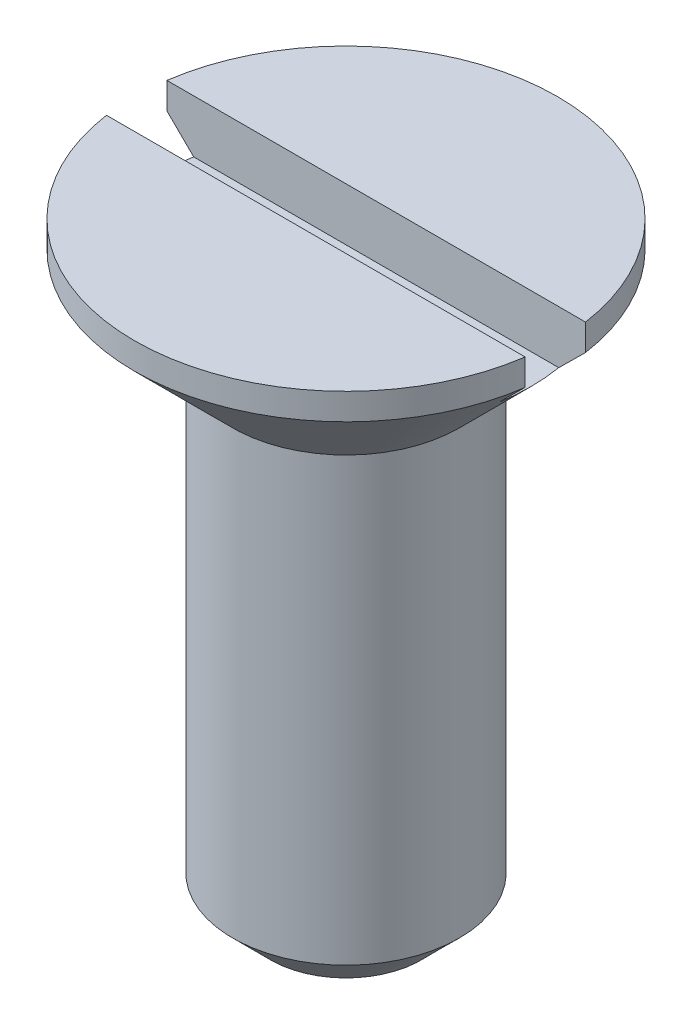
ISO-10303-21;
HEADER;
FILE_DESCRIPTION(('STEP AP214'),'2;1');
FILE_NAME('part.step','',(''),(''),'','','');
FILE_SCHEMA(('AUTOMOTIVE_DESIGN { 1 0 10303 214 1 1 1 1 }'));
ENDSEC;
DATA;
#1=APPLICATION_CONTEXT('core data for automotive mechanical design processes');
#2=APPLICATION_PROTOCOL_DEFINITION('international standard','automotive_design',2000,#1);
#3=PRODUCT_CONTEXT('',#1,'mechanical');
#4=PRODUCT('Part','Part','',(#3));
#5=PRODUCT_RELATED_PRODUCT_CATEGORY('part','',(#4));
#6=PRODUCT_DEFINITION_FORMATION('','',#4);
#7=PRODUCT_DEFINITION_CONTEXT('part definition',#1,'design');
#8=PRODUCT_DEFINITION('design','',#6,#7);
#9=PRODUCT_DEFINITION_SHAPE('','',#8);
#10=(LENGTH_UNIT() NAMED_UNIT(*) SI_UNIT(.MILLI.,.METRE.));
#11=(NAMED_UNIT(*) PLANE_ANGLE_UNIT() SI_UNIT($,.RADIAN.));
#12=(NAMED_UNIT(*) SI_UNIT($,.STERADIAN.) SOLID_ANGLE_UNIT());
#13=UNCERTAINTY_MEASURE_WITH_UNIT(LENGTH_MEASURE(1.E-05),#10,'distance_accuracy_value','');
#14=(GEOMETRIC_REPRESENTATION_CONTEXT(3) GLOBAL_UNCERTAINTY_ASSIGNED_CONTEXT((#13)) GLOBAL_UNIT_ASSIGNED_CONTEXT((#10,
#11,#12)) REPRESENTATION_CONTEXT('',''));
#15=CARTESIAN_POINT('',(0.,0.,0.));
#16=DIRECTION('',(0.,0.,1.));
#17=DIRECTION('',(1.,0.,0.));
#18=AXIS2_PLACEMENT_3D('',#15,#16,#17);
#19=CARTESIAN_POINT('',(0.,125.763182897862,0.));
#20=DIRECTION('',(0.,1.,0.));
#21=DIRECTION('',(-1.,0.,0.));
#22=AXIS2_PLACEMENT_3D('',#19,#20,#21);
#23=CYLINDRICAL_SURFACE('',#22,2.80000000000001);
#24=CARTESIAN_POINT('',(0.,91.6850422227854,0.));
#25=DIRECTION('',(0.,1.,0.));
#26=DIRECTION('',(-1.,0.,0.));
#27=AXIS2_PLACEMENT_3D('',#24,#25,#26);
#28=CIRCLE('',#27,2.80000000000001);
#29=CARTESIAN_POINT('',(2.77128129211021,91.6850422227854,-0.4));
#30=VERTEX_POINT('',#29);
#31=CARTESIAN_POINT('',(-2.77128129211022,91.6850422227854,-0.4));
#32=VERTEX_POINT('',#31);
#33=EDGE_CURVE('E103',#30,#32,#28,.T.);
#34=ORIENTED_EDGE('',*,*,#33,.T.);
#35=DIRECTION('',(0.,1.,0.));
#36=VECTOR('',#35,1.);
#37=CARTESIAN_POINT('',(-2.77128129211022,125.763182897862,-0.4));
#38=LINE('',#37,#36);
#39=CARTESIAN_POINT('',(-2.77128129211022,92.0350422227854,-0.4));
#40=VERTEX_POINT('',#39);
#41=EDGE_CURVE('E136',#32,#40,#38,.T.);
#42=ORIENTED_EDGE('',*,*,#41,.T.);
#43=CARTESIAN_POINT('',(0.,92.0350422227854,0.));
#44=DIRECTION('',(0.,1.,0.));
#45=DIRECTION('',(-1.,0.,0.));
#46=AXIS2_PLACEMENT_3D('',#43,#44,#45);
#47=CIRCLE('',#46,2.80000000000001);
#48=CARTESIAN_POINT('',(2.77128129211021,92.0350422227854,-0.4));
#49=VERTEX_POINT('',#48);
#50=EDGE_CURVE('E100',#49,#40,#47,.T.);
#51=ORIENTED_EDGE('',*,*,#50,.F.);
#52=DIRECTION('',(0.,1.,0.));
#53=VECTOR('',#52,1.);
#54=CARTESIAN_POINT('',(2.77128129211021,125.763182897862,-0.4));
#55=LINE('',#54,#53);
#56=EDGE_CURVE('E106',#49,#30,#55,.F.);
#57=ORIENTED_EDGE('',*,*,#56,.T.);
#58=EDGE_LOOP('',(#34,#42,#51,#57));
#59=FACE_BOUND('',#58,.T.);
#60=ADVANCED_FACE('F29',(#59),#23,.T.);
#61=CARTESIAN_POINT('',(0.,92.0350422227854,0.));
#62=DIRECTION('',(0.,-1.,0.));
#63=DIRECTION('',(1.,0.,0.));
#64=AXIS2_PLACEMENT_3D('',#61,#62,#63);
#65=PLANE('',#64);
#66=ORIENTED_EDGE('',*,*,#50,.T.);
#67=DIRECTION('',(1.,0.,0.));
#68=VECTOR('',#67,1.);
#69=CARTESIAN_POINT('',(0.,92.0350422227854,-0.4));
#70=LINE('',#69,#68);
#71=EDGE_CURVE('E88',#40,#49,#70,.T.);
#72=ORIENTED_EDGE('',*,*,#71,.T.);
#73=EDGE_LOOP('',(#66,#72));
#74=FACE_BOUND('',#73,.T.);
#75=ADVANCED_FACE('F162',(#74),#65,.F.);
#76=CARTESIAN_POINT('',(-2.77128129211022,91.6850422227854,0.4));
#77=VERTEX_POINT('',#76);
#78=CARTESIAN_POINT('',(2.77128129211021,91.6850422227854,0.4));
#79=VERTEX_POINT('',#78);
#80=EDGE_CURVE('E89',#77,#79,#28,.T.);
#81=ORIENTED_EDGE('',*,*,#80,.T.);
#82=DIRECTION('',(0.,1.,0.));
#83=VECTOR('',#82,1.);
#84=CARTESIAN_POINT('',(2.77128129211021,125.763182897862,0.4));
#85=LINE('',#84,#83);
#86=CARTESIAN_POINT('',(2.77128129211021,92.0350422227854,0.4));
#87=VERTEX_POINT('',#86);
#88=EDGE_CURVE('E83',#79,#87,#85,.T.);
#89=ORIENTED_EDGE('',*,*,#88,.T.);
#90=CARTESIAN_POINT('',(-2.77128129211022,92.0350422227854,0.4));
#91=VERTEX_POINT('',#90);
#92=EDGE_CURVE('E93',#91,#87,#47,.T.);
#93=ORIENTED_EDGE('',*,*,#92,.F.);
#94=DIRECTION('',(0.,1.,0.));
#95=VECTOR('',#94,1.);
#96=CARTESIAN_POINT('',(-2.77128129211022,125.763182897862,0.4));
#97=LINE('',#96,#95);
#98=EDGE_CURVE('E44',#91,#77,#97,.F.);
#99=ORIENTED_EDGE('',*,*,#98,.T.);
#100=EDGE_LOOP('',(#81,#89,#93,#99));
#101=FACE_BOUND('',#100,.T.);
#102=ADVANCED_FACE('F31',(#101),#23,.T.);
#103=CARTESIAN_POINT('',(0.,90.3850422227854,0.));
#104=DIRECTION('',(0.,1.,0.));
#105=DIRECTION('',(-1.,0.,0.));
#106=AXIS2_PLACEMENT_3D('',#103,#104,#105);
#107=CONICAL_SURFACE('',#106,1.50000000000001,0.785398163397445);
#108=ORIENTED_EDGE('',*,*,#33,.F.);
#109=CARTESIAN_POINT('',(6.15376964499759,95.0517983265805,-0.400000000000001));
#110=CARTESIAN_POINT('',(5.94224348350112,94.840721242218,-0.400000000000001));
#111=CARTESIAN_POINT('',(5.73069782055002,94.6296636833897,-0.400000000000001));
#112=CARTESIAN_POINT('',(5.30753814852964,94.2076089013756,-0.400000000000001));
#113=CARTESIAN_POINT('',(5.09592413821653,93.9966116794368,-0.400000000000001));
#114=CARTESIAN_POINT('',(4.6725142237376,93.5746149461533,-0.400000000000001));
#115=CARTESIAN_POINT('',(4.46071828049446,93.363615474014,-0.400000000000001));
#116=CARTESIAN_POINT('',(4.03699504309279,92.9417564142658,-0.400000000000001));
#117=CARTESIAN_POINT('',(3.82506775148861,92.7308968240922,-0.400000000000001));
#118=CARTESIAN_POINT('',(3.39796110186069,92.3063841744852,-0.4));
#119=CARTESIAN_POINT('',(3.18277858312349,92.0927342949834,-0.4));
#120=CARTESIAN_POINT('',(2.7520109573441,91.6658163047777,-0.4));
#121=CARTESIAN_POINT('',(2.53642582862041,91.4525482159209,-0.4));
#122=CARTESIAN_POINT('',(2.21246212200739,91.1332998015317,-0.4));
#123=CARTESIAN_POINT('',(2.10439149332944,91.027007228392,-0.4));
#124=CARTESIAN_POINT('',(1.8879200375853,90.8147539430028,-0.4));
#125=CARTESIAN_POINT('',(1.77951920317701,90.7087932382402,-0.4));
#126=CARTESIAN_POINT('',(1.5621944761014,90.4974300750143,-0.4));
#127=CARTESIAN_POINT('',(1.45327063843828,90.3920275601964,-0.4));
#128=CARTESIAN_POINT('',(1.28912929352075,90.234715493658,-0.4));
#129=CARTESIAN_POINT('',(1.23429058280153,90.1824110313711,-0.4));
#130=CARTESIAN_POINT('',(1.12424387511607,90.0781923940908,-0.4));
#131=CARTESIAN_POINT('',(1.06903588304917,90.0262782139387,-0.4));
#132=CARTESIAN_POINT('',(0.983474783419313,89.9466930085838,-0.4));
#133=CARTESIAN_POINT('',(0.95331974597589,89.9188092128691,-0.4));
#134=CARTESIAN_POINT('',(0.8927950464271,89.8632741952398,-0.4));
#135=CARTESIAN_POINT('',(0.8624253802002,89.8356229778138,-0.4));
#136=CARTESIAN_POINT('',(0.801425593006168,89.7806467407496,-0.4));
#137=CARTESIAN_POINT('',(0.770795647331402,89.753321527409,-0.4));
#138=CARTESIAN_POINT('',(0.709159312988183,89.6991025639975,-0.4));
#139=CARTESIAN_POINT('',(0.678152938714246,89.6722087975189,-0.4));
#140=CARTESIAN_POINT('',(0.601711767853773,89.6071772924953,-0.4));
#141=CARTESIAN_POINT('',(0.555997028960764,89.569362268687,-0.4));
#142=CARTESIAN_POINT('',(0.486022479031603,89.5143388831423,-0.4));
#143=CARTESIAN_POINT('',(0.462444581720205,89.4962672545415,-0.4));
#144=CARTESIAN_POINT('',(0.414668181078615,89.4609678967871,-0.4));
#145=CARTESIAN_POINT('',(0.390469811382847,89.4437399882048,-0.4));
#146=CARTESIAN_POINT('',(0.332528644992307,89.4046213507061,-0.4));
#147=CARTESIAN_POINT('',(0.298438523796045,89.3832378829465,-0.4));
#148=CARTESIAN_POINT('',(0.227989995719911,89.3445140352947,-0.4));
#149=CARTESIAN_POINT('',(0.191637882588598,89.327163021777,-0.4));
#150=CARTESIAN_POINT('',(0.130420816044102,89.3052059074646,-0.4));
#151=CARTESIAN_POINT('',(0.10642880807801,89.2982619280238,-0.4));
#152=CARTESIAN_POINT('',(0.0576606648347406,89.2884774731962,-0.4));
#153=CARTESIAN_POINT('',(0.0328876933913012,89.2856221880439,-0.4));
#154=CARTESIAN_POINT('',(-0.0168874599605493,89.2846222445155,-0.4));
#155=CARTESIAN_POINT('',(-0.0418901654491117,89.28650188713,-0.4));
#156=CARTESIAN_POINT('',(-0.0912113554483213,89.2945794640738,-0.4));
#157=CARTESIAN_POINT('',(-0.11552773905749,89.3007894176915,-0.4));
#158=CARTESIAN_POINT('',(-0.16380547199542,89.3166593926004,-0.4));
#159=CARTESIAN_POINT('',(-0.18773151942435,89.3264219136148,-0.4));
#160=CARTESIAN_POINT('',(-0.234521299889117,89.3482604752016,-0.4));
#161=CARTESIAN_POINT('',(-0.257383020337466,89.360340693889,-0.4));
#162=CARTESIAN_POINT('',(-0.302392866406819,89.3861396867375,-0.4));
#163=CARTESIAN_POINT('',(-0.324533692268337,89.3998709668022,-0.4));
#164=CARTESIAN_POINT('',(-0.368091142585359,89.4283860332485,-0.4));
#165=CARTESIAN_POINT('',(-0.389508367534428,89.4431689136386,-0.4));
#166=CARTESIAN_POINT('',(-0.456611639791696,89.4912195580824,-0.4));
#167=CARTESIAN_POINT('',(-0.50131882876468,89.5258438581652,-0.4));
#168=CARTESIAN_POINT('',(-0.589333151358712,89.5968387408742,-0.4));
#169=CARTESIAN_POINT('',(-0.632639344400892,89.6332104575467,-0.4));
#170=CARTESIAN_POINT('',(-0.718448415425899,89.7070453584291,-0.4));
#171=CARTESIAN_POINT('',(-0.760949672140399,89.7445104243675,-0.4));
#172=CARTESIAN_POINT('',(-0.845359308704239,89.8200735443918,-0.4));
#173=CARTESIAN_POINT('',(-0.887267858807438,89.8581714095773,-0.4));
#174=CARTESIAN_POINT('',(-1.01216330814142,89.9728721148943,-0.4));
#175=CARTESIAN_POINT('',(-1.09457157164822,90.0501038770166,-0.4));
#176=CARTESIAN_POINT('',(-1.25849767626772,90.2053245759997,-0.4));
#177=CARTESIAN_POINT('',(-1.34001637946953,90.283312609494,-0.4));
#178=CARTESIAN_POINT('',(-1.50218627159786,90.4394174140191,-0.4));
#179=CARTESIAN_POINT('',(-1.58283974181426,90.5175318152214,-0.4));
#180=CARTESIAN_POINT('',(-1.7438418683818,90.6740742999587,-0.4));
#181=CARTESIAN_POINT('',(-1.82419052327697,90.7525023849883,-0.4));
#182=CARTESIAN_POINT('',(-2.06493581330267,90.9881001041679,-0.4));
#183=CARTESIAN_POINT('',(-2.22502858211589,91.1455801110599,-0.4));
#184=CARTESIAN_POINT('',(-2.54487140750702,91.4610264248858,-0.4));
#185=CARTESIAN_POINT('',(-2.70462128390291,91.6189929141463,-0.4));
#186=CARTESIAN_POINT('',(-3.02387107200538,91.935175267987,-0.4));
#187=CARTESIAN_POINT('',(-3.18337098605438,92.0933911302021,-0.4));
#188=CARTESIAN_POINT('',(-3.66161213354478,92.5682397576378,-0.4));
#189=CARTESIAN_POINT('',(-3.98012447834661,92.885102945423,-0.4));
#190=CARTESIAN_POINT('',(-4.61683093750955,93.5190791605516,-0.399999999999999));
#191=CARTESIAN_POINT('',(-4.93502508283666,93.8361921568168,-0.399999999999999));
#192=CARTESIAN_POINT('',(-5.40327653343319,94.3030925346914,-0.399999999999999));
#193=CARTESIAN_POINT('',(-5.55339720221333,94.4528163705911,-0.399999999999999));
#194=CARTESIAN_POINT('',(-5.85360544609959,94.7522892561713,-0.399999999999999));
#195=CARTESIAN_POINT('',(-6.00369302197777,94.9020383050777,-0.399999999999999));
#196=CARTESIAN_POINT('',(-6.15376964499761,95.0517983265805,-0.399999999999999));
#197=B_SPLINE_CURVE_WITH_KNOTS('',3,(#109,#110,#111,#112,#113,#114,#115,#116,#117,#118,#119,
#120,#121,#122,#123,#124,#125,#126,#127,#128,#129,#130,#131,#132,#133,#134,#135,#136,#137,#138,
#139,#140,#141,#142,#143,#144,#145,#146,#147,#148,#149,#150,#151,#152,#153,#154,#155,#156,#157,
#158,#159,#160,#161,#162,#163,#164,#165,#166,#167,#168,#169,#170,#171,#172,#173,#174,#175,#176,
#177,#178,#179,#180,#181,#182,#183,#184,#185,#186,#187,#188,#189,#190,#191,#192,#193,#194,#195,
#196),.UNSPECIFIED.,.F.,.F.,(4,2,2,2,2,2,2,2,2,2,2,2,2,2,2,2,2,2,2,2,2,2,2,2,2,2,2,2,2,2,2,2,2,
2,2,2,2,2,2,2,2,2,2,4),(0.,0.896477387067401,1.79297212919518,2.68985820595076,3.5867273563352,
4.49642391407687,5.40617096156973,5.86091909041101,6.31567740544315,6.77038889774219,
6.99773639013607,7.22508087221738,7.34829311300866,7.47150772631838,7.59464506423539,
7.71777770815696,7.89571062797183,7.98481890806048,8.07390815501086,8.19452277680273,
8.31481563318155,8.38948065025888,8.46387453115933,8.53865099959746,8.61363584938589,
8.69098233996737,8.76846959595682,8.84658590529905,8.9246357111978,9.09417060464475,
9.26381705040649,9.43377503776829,9.60368317069483,9.9424934975876,10.2809395472855,
10.6177784763891,10.9546190123933,11.6283134141745,12.302302002651,12.9762842368722,
14.3241233595907,15.6718152257355,16.3078820257655,16.9439319573642),.UNSPECIFIED.);
#198=CARTESIAN_POINT('',(2.41712639305435,91.3350422227853,-0.4));
#199=VERTEX_POINT('',#198);
#200=EDGE_CURVE('E52',#30,#199,#197,.T.);
#201=ORIENTED_EDGE('',*,*,#200,.T.);
#202=CARTESIAN_POINT('',(0.,91.3350422227853,0.));
#203=DIRECTION('',(0.,1.,0.));
#204=DIRECTION('',(0.,0.,1.));
#205=AXIS2_PLACEMENT_3D('',#202,#203,#204);
#206=CIRCLE('',#205,2.45);
#207=CARTESIAN_POINT('',(2.41712639305435,91.3350422227853,0.4));
#208=VERTEX_POINT('',#207);
#209=EDGE_CURVE('E115',#208,#199,#206,.T.);
#210=ORIENTED_EDGE('',*,*,#209,.F.);
#211=CARTESIAN_POINT('',(-6.15376964499761,95.0517983265805,0.400000000000001));
#212=CARTESIAN_POINT('',(-5.94224348350114,94.840721242218,0.400000000000001));
#213=CARTESIAN_POINT('',(-5.73069782055004,94.6296636833898,0.400000000000001));
#214=CARTESIAN_POINT('',(-5.30753814852967,94.2076089013756,0.400000000000001));
#215=CARTESIAN_POINT('',(-5.09592413821655,93.9966116794369,0.400000000000001));
#216=CARTESIAN_POINT('',(-4.67251422373763,93.5746149461533,0.400000000000001));
#217=CARTESIAN_POINT('',(-4.46071828049449,93.363615474014,0.400000000000001));
#218=CARTESIAN_POINT('',(-4.03699504309284,92.9417564142658,0.400000000000001));
#219=CARTESIAN_POINT('',(-3.82506775148865,92.7308968240922,0.4));
#220=CARTESIAN_POINT('',(-3.39796110186072,92.3063841744852,0.4));
#221=CARTESIAN_POINT('',(-3.18277858312352,92.0927342949834,0.4));
#222=CARTESIAN_POINT('',(-2.75201095734414,91.6658163047777,0.4));
#223=CARTESIAN_POINT('',(-2.53642582862045,91.4525482159209,0.4));
#224=CARTESIAN_POINT('',(-2.21246212200743,91.1332998015317,0.4));
#225=CARTESIAN_POINT('',(-2.10439149332948,91.027007228392,0.4));
#226=CARTESIAN_POINT('',(-1.88792003758533,90.8147539430028,0.4));
#227=CARTESIAN_POINT('',(-1.77951920317704,90.7087932382402,0.4));
#228=CARTESIAN_POINT('',(-1.56219447610142,90.4974300750143,0.4));
#229=CARTESIAN_POINT('',(-1.45327063843829,90.3920275601964,0.4));
#230=CARTESIAN_POINT('',(-1.28912929352077,90.234715493658,0.4));
#231=CARTESIAN_POINT('',(-1.23429058280155,90.1824110313711,0.4));
#232=CARTESIAN_POINT('',(-1.12424387511609,90.0781923940908,0.4));
#233=CARTESIAN_POINT('',(-1.06903588304919,90.0262782139387,0.4));
#234=CARTESIAN_POINT('',(-0.983474783419322,89.9466930085838,0.4));
#235=CARTESIAN_POINT('',(-0.953319745975897,89.9188092128691,0.4));
#236=CARTESIAN_POINT('',(-0.89279504642711,89.8632741952398,0.4));
#237=CARTESIAN_POINT('',(-0.862425380200216,89.8356229778138,0.4));
#238=CARTESIAN_POINT('',(-0.801425593006187,89.7806467407496,0.4));
#239=CARTESIAN_POINT('',(-0.770795647331419,89.753321527409,0.4));
#240=CARTESIAN_POINT('',(-0.709159312988199,89.6991025639975,0.4));
#241=CARTESIAN_POINT('',(-0.678152938714263,89.6722087975189,0.4));
#242=CARTESIAN_POINT('',(-0.601711767853792,89.6071772924953,0.4));
#243=CARTESIAN_POINT('',(-0.555997028960782,89.569362268687,0.4));
#244=CARTESIAN_POINT('',(-0.486022479031623,89.5143388831424,0.4));
#245=CARTESIAN_POINT('',(-0.462444581720224,89.4962672545415,0.4));
#246=CARTESIAN_POINT('',(-0.414668181078632,89.4609678967871,0.4));
#247=CARTESIAN_POINT('',(-0.390469811382861,89.4437399882048,0.4));
#248=CARTESIAN_POINT('',(-0.332528644992319,89.4046213507061,0.4));
#249=CARTESIAN_POINT('',(-0.298438523796057,89.3832378829465,0.4));
#250=CARTESIAN_POINT('',(-0.227989995719923,89.3445140352947,0.4));
#251=CARTESIAN_POINT('',(-0.191637882588611,89.327163021777,0.4));
#252=CARTESIAN_POINT('',(-0.130420816044115,89.3052059074646,0.4));
#253=CARTESIAN_POINT('',(-0.106428808078023,89.2982619280238,0.4));
#254=CARTESIAN_POINT('',(-0.0576606648347534,89.2884774731962,0.4));
#255=CARTESIAN_POINT('',(-0.0328876933913141,89.2856221880439,0.4));
#256=CARTESIAN_POINT('',(0.0168874599605377,89.2846222445155,0.4));
#257=CARTESIAN_POINT('',(0.0418901654491015,89.28650188713,0.4));
#258=CARTESIAN_POINT('',(0.0912113554483107,89.2945794640738,0.4));
#259=CARTESIAN_POINT('',(0.115527739057478,89.3007894176915,0.4));
#260=CARTESIAN_POINT('',(0.163805471995408,89.3166593926004,0.4));
#261=CARTESIAN_POINT('',(0.187731519424341,89.3264219136148,0.4));
#262=CARTESIAN_POINT('',(0.234521299889108,89.3482604752016,0.4));
#263=CARTESIAN_POINT('',(0.257383020337454,89.360340693889,0.4));
#264=CARTESIAN_POINT('',(0.302392866406805,89.3861396867375,0.4));
#265=CARTESIAN_POINT('',(0.324533692268323,89.3998709668022,0.4));
#266=CARTESIAN_POINT('',(0.368091142585346,89.4283860332485,0.4));
#267=CARTESIAN_POINT('',(0.389508367534415,89.4431689136386,0.4));
#268=CARTESIAN_POINT('',(0.456611639791688,89.4912195580824,0.4));
#269=CARTESIAN_POINT('',(0.501318828764677,89.5258438581653,0.4));
#270=CARTESIAN_POINT('',(0.589333151358709,89.5968387408742,0.4));
#271=CARTESIAN_POINT('',(0.632639344400882,89.6332104575467,0.4));
#272=CARTESIAN_POINT('',(0.718448415425888,89.7070453584291,0.4));
#273=CARTESIAN_POINT('',(0.760949672140392,89.7445104243675,0.4));
#274=CARTESIAN_POINT('',(0.845359308704232,89.8200735443918,0.4));
#275=CARTESIAN_POINT('',(0.887267858807427,89.8581714095773,0.4));
#276=CARTESIAN_POINT('',(1.01216330814141,89.9728721148944,0.4));
#277=CARTESIAN_POINT('',(1.09457157164821,90.0501038770166,0.4));
#278=CARTESIAN_POINT('',(1.25849767626771,90.2053245759997,0.4));
#279=CARTESIAN_POINT('',(1.34001637946952,90.283312609494,0.4));
#280=CARTESIAN_POINT('',(1.50218627159784,90.4394174140191,0.4));
#281=CARTESIAN_POINT('',(1.58283974181425,90.5175318152214,0.4));
#282=CARTESIAN_POINT('',(1.74384186838178,90.6740742999587,0.4));
#283=CARTESIAN_POINT('',(1.82419052327695,90.7525023849883,0.4));
#284=CARTESIAN_POINT('',(2.06493581330266,90.9881001041679,0.4));
#285=CARTESIAN_POINT('',(2.22502858211588,91.1455801110599,0.4));
#286=CARTESIAN_POINT('',(2.544871407507,91.4610264248858,0.4));
#287=CARTESIAN_POINT('',(2.7046212839029,91.6189929141463,0.4));
#288=CARTESIAN_POINT('',(3.02387107200537,91.935175267987,0.4));
#289=CARTESIAN_POINT('',(3.18337098605437,92.0933911302021,0.4));
#290=CARTESIAN_POINT('',(3.66161213354476,92.5682397576378,0.4));
#291=CARTESIAN_POINT('',(3.9801244783466,92.885102945423,0.4));
#292=CARTESIAN_POINT('',(4.61683093750954,93.5190791605516,0.399999999999999));
#293=CARTESIAN_POINT('',(4.93502508283664,93.8361921568168,0.399999999999999));
#294=CARTESIAN_POINT('',(5.40327653343317,94.3030925346914,0.399999999999999));
#295=CARTESIAN_POINT('',(5.55339720221331,94.4528163705911,0.399999999999999));
#296=CARTESIAN_POINT('',(5.85360544609957,94.7522892561713,0.399999999999999));
#297=CARTESIAN_POINT('',(6.00369302197775,94.9020383050777,0.399999999999999));
#298=CARTESIAN_POINT('',(6.15376964499759,95.0517983265805,0.399999999999999));
#299=B_SPLINE_CURVE_WITH_KNOTS('',3,(#211,#212,#213,#214,#215,#216,#217,#218,#219,#220,#221,
#222,#223,#224,#225,#226,#227,#228,#229,#230,#231,#232,#233,#234,#235,#236,#237,#238,#239,#240,
#241,#242,#243,#244,#245,#246,#247,#248,#249,#250,#251,#252,#253,#254,#255,#256,#257,#258,#259,
#260,#261,#262,#263,#264,#265,#266,#267,#268,#269,#270,#271,#272,#273,#274,#275,#276,#277,#278,
#279,#280,#281,#282,#283,#284,#285,#286,#287,#288,#289,#290,#291,#292,#293,#294,#295,#296,#297,
#298),.UNSPECIFIED.,.F.,.F.,(4,2,2,2,2,2,2,2,2,2,2,2,2,2,2,2,2,2,2,2,2,2,2,2,2,2,2,2,2,2,2,2,2,
2,2,2,2,2,2,2,2,2,2,4),(0.,0.896477387067386,1.79297212919516,2.68985820595074,3.58672735633516,
4.49642391407684,5.40617096156971,5.86091909041097,6.31567740544313,6.77038889774218,
6.99773639013607,7.22508087221738,7.34829311300866,7.47150772631838,7.59464506423538,
7.71777770815696,7.89571062797182,7.98481890806047,8.07390815501086,8.19452277680273,
8.31481563318155,8.38948065025888,8.46387453115933,8.53865099959746,8.6136358493859,
8.69098233996738,8.76846959595683,8.84658590529906,8.9246357111978,9.09417060464477,
9.26381705040649,9.4337750377683,9.60368317069483,9.9424934975876,10.2809395472855,
10.6177784763891,10.9546190123933,11.6283134141745,12.302302002651,12.9762842368722,
14.3241233595907,15.6718152257355,16.3078820257655,16.9439319573642),.UNSPECIFIED.);
#300=EDGE_CURVE('E96',#208,#79,#299,.T.);
#301=ORIENTED_EDGE('',*,*,#300,.T.);
#302=ORIENTED_EDGE('',*,*,#80,.F.);
#303=CARTESIAN_POINT('',(-2.41712639305437,91.3350422227853,0.4));
#304=VERTEX_POINT('',#303);
#305=EDGE_CURVE('E95',#77,#304,#299,.T.);
#306=ORIENTED_EDGE('',*,*,#305,.T.);
#307=CARTESIAN_POINT('',(-2.41712639305437,91.3350422227853,-0.4));
#308=VERTEX_POINT('',#307);
#309=EDGE_CURVE('E114',#308,#304,#206,.T.);
#310=ORIENTED_EDGE('',*,*,#309,.F.);
#311=EDGE_CURVE('E131',#308,#32,#197,.T.);
#312=ORIENTED_EDGE('',*,*,#311,.T.);
#313=EDGE_LOOP('',(#108,#201,#210,#301,#302,#306,#310,#312));
#314=FACE_BOUND('',#313,.T.);
#315=CARTESIAN_POINT('',(0.,90.3850422227854,0.));
#316=DIRECTION('',(0.,1.,0.));
#317=DIRECTION('',(-1.,0.,0.));
#318=AXIS2_PLACEMENT_3D('',#315,#316,#317);
#319=CIRCLE('',#318,1.50000000000001);
#320=CARTESIAN_POINT('',(-1.50000000000002,90.3850422227854,0.));
#321=VERTEX_POINT('',#320);
#322=EDGE_CURVE('E99',#321,#321,#319,.T.);
#323=ORIENTED_EDGE('',*,*,#322,.T.);
#324=EDGE_LOOP('',(#323));
#325=FACE_BOUND('',#324,.T.);
#326=ADVANCED_FACE('F134',(#314,#325),#107,.T.);
#327=CARTESIAN_POINT('',(0.,125.763182897862,0.));
#328=DIRECTION('',(0.,1.,0.));
#329=DIRECTION('',(-1.,0.,0.));
#330=AXIS2_PLACEMENT_3D('',#327,#328,#329);
#331=CYLINDRICAL_SURFACE('',#330,1.50000000000001);
#332=CARTESIAN_POINT('',(0.,84.5350422227853,0.));
#333=DIRECTION('',(0.,1.,0.));
#334=DIRECTION('',(-1.,0.,0.));
#335=AXIS2_PLACEMENT_3D('',#332,#333,#334);
#336=CIRCLE('',#335,1.50000000000001);
#337=CARTESIAN_POINT('',(-1.50000000000002,84.5350422227853,0.));
#338=VERTEX_POINT('',#337);
#339=EDGE_CURVE('E37',#338,#338,#336,.T.);
#340=ORIENTED_EDGE('',*,*,#339,.T.);
#341=EDGE_LOOP('',(#340));
#342=FACE_BOUND('',#341,.T.);
#343=ORIENTED_EDGE('',*,*,#322,.F.);
#344=EDGE_LOOP('',(#343));
#345=FACE_BOUND('',#344,.T.);
#346=ADVANCED_FACE('F164',(#342,#345),#331,.T.);
#347=CARTESIAN_POINT('',(1.50000000000001,84.0350422227853,0.));
#348=DIRECTION('',(0.,1.,0.));
#349=DIRECTION('',(-1.,0.,0.));
#350=AXIS2_PLACEMENT_3D('',#347,#348,#349);
#351=PLANE('',#350);
#352=CARTESIAN_POINT('',(0.,84.0350422227853,0.));
#353=DIRECTION('',(0.,1.,0.));
#354=DIRECTION('',(-1.,0.,0.));
#355=AXIS2_PLACEMENT_3D('',#352,#353,#354);
#356=CIRCLE('',#355,1.00000000000001);
#357=CARTESIAN_POINT('',(-1.00000000000001,84.0350422227853,0.));
#358=VERTEX_POINT('',#357);
#359=EDGE_CURVE('E11',#358,#358,#356,.F.);
#360=ORIENTED_EDGE('',*,*,#359,.T.);
#361=EDGE_LOOP('',(#360));
#362=FACE_BOUND('',#361,.T.);
#363=ADVANCED_FACE('F161',(#362),#351,.F.);
#364=ORIENTED_EDGE('',*,*,#92,.T.);
#365=DIRECTION('',(-1.,0.,0.));
#366=VECTOR('',#365,1.);
#367=CARTESIAN_POINT('',(0.,92.0350422227854,0.4));
#368=LINE('',#367,#366);
#369=EDGE_CURVE('E80',#87,#91,#368,.T.);
#370=ORIENTED_EDGE('',*,*,#369,.T.);
#371=EDGE_LOOP('',(#364,#370));
#372=FACE_BOUND('',#371,.T.);
#373=ADVANCED_FACE('F98',(#372),#65,.F.);
#374=CARTESIAN_POINT('',(-2.80000000000001,91.3350422227853,0.4));
#375=DIRECTION('',(0.,1.,0.));
#376=DIRECTION('',(0.,0.,1.));
#377=AXIS2_PLACEMENT_3D('',#374,#375,#376);
#378=PLANE('',#377);
#379=ORIENTED_EDGE('',*,*,#209,.T.);
#380=DIRECTION('',(-1.,0.,0.));
#381=VECTOR('',#380,1.);
#382=CARTESIAN_POINT('',(-2.80000000000001,91.3350422227853,-0.4));
#383=LINE('',#382,#381);
#384=EDGE_CURVE('E124',#199,#308,#383,.T.);
#385=ORIENTED_EDGE('',*,*,#384,.T.);
#386=ORIENTED_EDGE('',*,*,#309,.T.);
#387=DIRECTION('',(1.,0.,0.));
#388=VECTOR('',#387,1.);
#389=CARTESIAN_POINT('',(-2.80000000000001,91.3350422227853,0.4));
#390=LINE('',#389,#388);
#391=EDGE_CURVE('E127',#304,#208,#390,.T.);
#392=ORIENTED_EDGE('',*,*,#391,.T.);
#393=EDGE_LOOP('',(#379,#385,#386,#392));
#394=FACE_BOUND('',#393,.T.);
#395=ADVANCED_FACE('F123',(#394),#378,.T.);
#396=CARTESIAN_POINT('',(-2.80000000000001,91.3350422227853,-0.4));
#397=DIRECTION('',(0.,0.,-1.));
#398=DIRECTION('',(-1.,0.,0.));
#399=AXIS2_PLACEMENT_3D('',#396,#397,#398);
#400=PLANE('',#399);
#401=ORIENTED_EDGE('',*,*,#71,.F.);
#402=ORIENTED_EDGE('',*,*,#41,.F.);
#403=ORIENTED_EDGE('',*,*,#311,.F.);
#404=ORIENTED_EDGE('',*,*,#384,.F.);
#405=ORIENTED_EDGE('',*,*,#200,.F.);
#406=ORIENTED_EDGE('',*,*,#56,.F.);
#407=EDGE_LOOP('',(#401,#402,#403,#404,#405,#406));
#408=FACE_BOUND('',#407,.T.);
#409=ADVANCED_FACE('F129',(#408),#400,.F.);
#410=CARTESIAN_POINT('',(-2.80000000000001,91.3350422227853,0.4));
#411=DIRECTION('',(0.,0.,1.));
#412=DIRECTION('',(1.,0.,0.));
#413=AXIS2_PLACEMENT_3D('',#410,#411,#412);
#414=PLANE('',#413);
#415=ORIENTED_EDGE('',*,*,#369,.F.);
#416=ORIENTED_EDGE('',*,*,#88,.F.);
#417=ORIENTED_EDGE('',*,*,#300,.F.);
#418=ORIENTED_EDGE('',*,*,#391,.F.);
#419=ORIENTED_EDGE('',*,*,#305,.F.);
#420=ORIENTED_EDGE('',*,*,#98,.F.);
#421=EDGE_LOOP('',(#415,#416,#417,#418,#419,#420));
#422=FACE_BOUND('',#421,.T.);
#423=ADVANCED_FACE('F82',(#422),#414,.F.);
#424=CARTESIAN_POINT('',(0.,84.5350422227853,0.));
#425=DIRECTION('',(0.,1.,0.));
#426=DIRECTION('',(-1.,0.,0.));
#427=AXIS2_PLACEMENT_3D('',#424,#425,#426);
#428=CONICAL_SURFACE('',#427,1.50000000000001,0.785398163397451);
#429=ORIENTED_EDGE('',*,*,#359,.F.);
#430=EDGE_LOOP('',(#429));
#431=FACE_BOUND('',#430,.T.);
#432=ORIENTED_EDGE('',*,*,#339,.F.);
#433=EDGE_LOOP('',(#432));
#434=FACE_BOUND('',#433,.T.);
#435=ADVANCED_FACE('F156',(#431,#434),#428,.T.);
#436=CLOSED_SHELL('',(#60,#75,#102,#326,#346,#363,#373,#395,#409,#423,#435));
#437=MANIFOLD_SOLID_BREP('B2',#436);
#438=ADVANCED_BREP_SHAPE_REPRESENTATION('',(#18,#437),#14);
#439=SHAPE_DEFINITION_REPRESENTATION(#9,#438);
ENDSEC;
END-ISO-10303-21;
